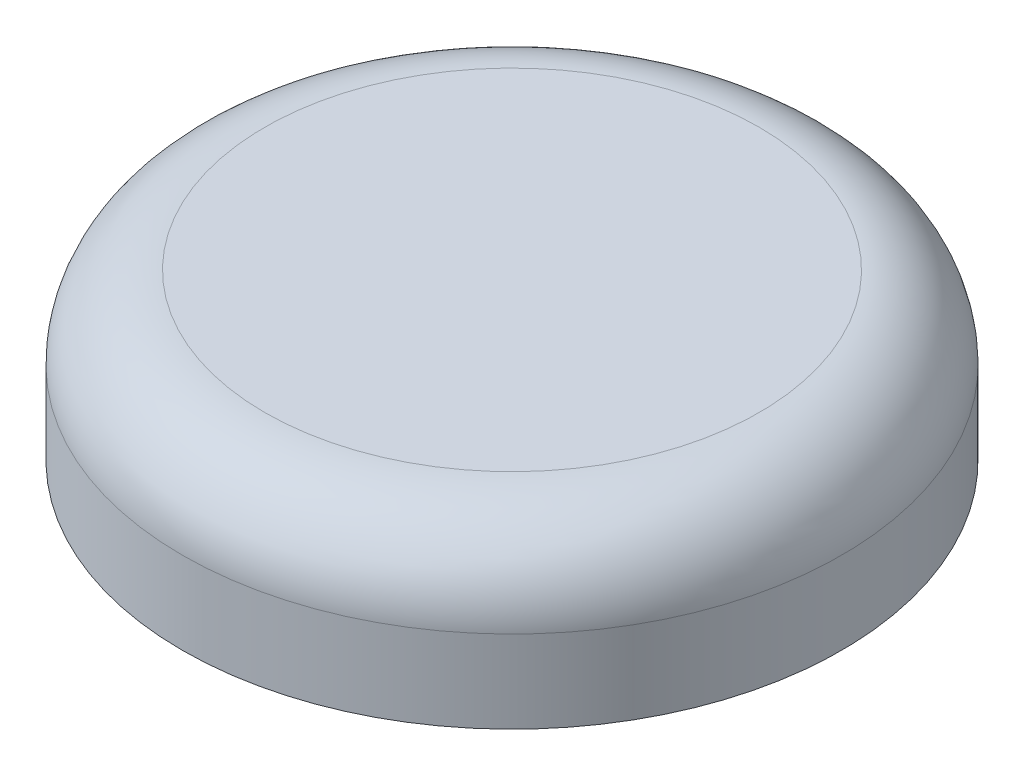
ISO-10303-21;
HEADER;
FILE_DESCRIPTION(('STEP AP214'),'2;1');
FILE_NAME('part.step','',(''),(''),'','','');
FILE_SCHEMA(('AUTOMOTIVE_DESIGN { 1 0 10303 214 1 1 1 1 }'));
ENDSEC;
DATA;
#1=APPLICATION_CONTEXT('core data for automotive mechanical design processes');
#2=APPLICATION_PROTOCOL_DEFINITION('international standard','automotive_design',2000,#1);
#3=PRODUCT_CONTEXT('',#1,'mechanical');
#4=PRODUCT('Part','Part','',(#3));
#5=PRODUCT_RELATED_PRODUCT_CATEGORY('part','',(#4));
#6=PRODUCT_DEFINITION_FORMATION('','',#4);
#7=PRODUCT_DEFINITION_CONTEXT('part definition',#1,'design');
#8=PRODUCT_DEFINITION('design','',#6,#7);
#9=PRODUCT_DEFINITION_SHAPE('','',#8);
#10=(LENGTH_UNIT() NAMED_UNIT(*) SI_UNIT(.MILLI.,.METRE.));
#11=(NAMED_UNIT(*) PLANE_ANGLE_UNIT() SI_UNIT($,.RADIAN.));
#12=(NAMED_UNIT(*) SI_UNIT($,.STERADIAN.) SOLID_ANGLE_UNIT());
#13=UNCERTAINTY_MEASURE_WITH_UNIT(LENGTH_MEASURE(1.E-05),#10,'distance_accuracy_value','');
#14=(GEOMETRIC_REPRESENTATION_CONTEXT(3) GLOBAL_UNCERTAINTY_ASSIGNED_CONTEXT((#13)) GLOBAL_UNIT_ASSIGNED_CONTEXT((#10,
#11,#12)) REPRESENTATION_CONTEXT('',''));
#15=CARTESIAN_POINT('',(0.,0.,0.));
#16=DIRECTION('',(0.,0.,1.));
#17=DIRECTION('',(1.,0.,0.));
#18=AXIS2_PLACEMENT_3D('',#15,#16,#17);
#19=CARTESIAN_POINT('',(0.,10.,0.));
#20=DIRECTION('',(0.,-1.,0.));
#21=DIRECTION('',(0.,0.,-1.));
#22=AXIS2_PLACEMENT_3D('',#19,#20,#21);
#23=CYLINDRICAL_SURFACE('',#22,20.);
#24=CARTESIAN_POINT('',(0.,5.,0.));
#25=DIRECTION('',(0.,1.,0.));
#26=DIRECTION('',(0.,0.,1.));
#27=AXIS2_PLACEMENT_3D('',#24,#25,#26);
#28=CIRCLE('',#27,20.);
#29=CARTESIAN_POINT('',(0.,5.,20.));
#30=VERTEX_POINT('',#29);
#31=EDGE_CURVE('E10',#30,#30,#28,.F.);
#32=ORIENTED_EDGE('',*,*,#31,.T.);
#33=EDGE_LOOP('',(#32));
#34=FACE_BOUND('',#33,.T.);
#35=CARTESIAN_POINT('',(0.,0.,0.));
#36=DIRECTION('',(0.,1.,0.));
#37=DIRECTION('',(0.,0.,1.));
#38=AXIS2_PLACEMENT_3D('',#35,#36,#37);
#39=CIRCLE('',#38,20.);
#40=CARTESIAN_POINT('',(0.,0.,20.));
#41=VERTEX_POINT('',#40);
#42=EDGE_CURVE('E49',#41,#41,#39,.T.);
#43=ORIENTED_EDGE('',*,*,#42,.T.);
#44=EDGE_LOOP('',(#43));
#45=FACE_BOUND('',#44,.T.);
#46=ADVANCED_FACE('F39',(#34,#45),#23,.T.);
#47=CARTESIAN_POINT('',(0.,10.,0.));
#48=DIRECTION('',(0.,1.,0.));
#49=DIRECTION('',(0.,0.,1.));
#50=AXIS2_PLACEMENT_3D('',#47,#48,#49);
#51=PLANE('',#50);
#52=CARTESIAN_POINT('',(0.,10.,0.));
#53=DIRECTION('',(0.,1.,0.));
#54=DIRECTION('',(0.,0.,1.));
#55=AXIS2_PLACEMENT_3D('',#52,#53,#54);
#56=CIRCLE('',#55,15.);
#57=CARTESIAN_POINT('',(0.,10.,15.));
#58=VERTEX_POINT('',#57);
#59=EDGE_CURVE('E46',#58,#58,#56,.T.);
#60=ORIENTED_EDGE('',*,*,#59,.T.);
#61=EDGE_LOOP('',(#60));
#62=FACE_BOUND('',#61,.T.);
#63=ADVANCED_FACE('F74',(#62),#51,.T.);
#64=CARTESIAN_POINT('',(0.,0.,0.));
#65=DIRECTION('',(0.,1.,0.));
#66=DIRECTION('',(0.,0.,1.));
#67=AXIS2_PLACEMENT_3D('',#64,#65,#66);
#68=PLANE('',#67);
#69=CARTESIAN_POINT('',(0.,0.,0.));
#70=DIRECTION('',(0.,-1.,0.));
#71=DIRECTION('',(0.,0.,-1.));
#72=AXIS2_PLACEMENT_3D('',#69,#70,#71);
#73=CIRCLE('',#72,10.);
#74=CARTESIAN_POINT('',(0.,0.,-10.));
#75=VERTEX_POINT('',#74);
#76=EDGE_CURVE('E60',#75,#75,#73,.T.);
#77=ORIENTED_EDGE('',*,*,#76,.F.);
#78=EDGE_LOOP('',(#77));
#79=FACE_BOUND('',#78,.T.);
#80=ORIENTED_EDGE('',*,*,#42,.F.);
#81=EDGE_LOOP('',(#80));
#82=FACE_BOUND('',#81,.T.);
#83=ADVANCED_FACE('F72',(#79,#82),#68,.F.);
#84=CARTESIAN_POINT('',(0.,5.,0.));
#85=DIRECTION('',(0.,1.,0.));
#86=DIRECTION('',(0.,0.,1.));
#87=AXIS2_PLACEMENT_3D('',#84,#85,#86);
#88=TOROIDAL_SURFACE('',#87,15.,5.);
#89=ORIENTED_EDGE('',*,*,#31,.F.);
#90=EDGE_LOOP('',(#89));
#91=FACE_BOUND('',#90,.T.);
#92=ORIENTED_EDGE('',*,*,#59,.F.);
#93=EDGE_LOOP('',(#92));
#94=FACE_BOUND('',#93,.T.);
#95=ADVANCED_FACE('F41',(#91,#94),#88,.T.);
#96=CARTESIAN_POINT('',(0.,5.,0.));
#97=DIRECTION('',(0.,-1.,0.));
#98=DIRECTION('',(0.,0.,-1.));
#99=AXIS2_PLACEMENT_3D('',#96,#97,#98);
#100=CYLINDRICAL_SURFACE('',#99,10.);
#101=CARTESIAN_POINT('',(0.,5.,0.));
#102=DIRECTION('',(0.,-1.,0.));
#103=DIRECTION('',(0.,0.,-1.));
#104=AXIS2_PLACEMENT_3D('',#101,#102,#103);
#105=CIRCLE('',#104,10.);
#106=CARTESIAN_POINT('',(0.,5.,-10.));
#107=VERTEX_POINT('',#106);
#108=EDGE_CURVE('E53',#107,#107,#105,.T.);
#109=ORIENTED_EDGE('',*,*,#108,.F.);
#110=EDGE_LOOP('',(#109));
#111=FACE_BOUND('',#110,.T.);
#112=ORIENTED_EDGE('',*,*,#76,.T.);
#113=EDGE_LOOP('',(#112));
#114=FACE_BOUND('',#113,.T.);
#115=ADVANCED_FACE('F63',(#111,#114),#100,.F.);
#116=CARTESIAN_POINT('',(0.,5.,0.));
#117=DIRECTION('',(0.,-1.,0.));
#118=DIRECTION('',(0.,0.,-1.));
#119=AXIS2_PLACEMENT_3D('',#116,#117,#118);
#120=PLANE('',#119);
#121=ORIENTED_EDGE('',*,*,#108,.T.);
#122=EDGE_LOOP('',(#121));
#123=FACE_BOUND('',#122,.T.);
#124=ADVANCED_FACE('F64',(#123),#120,.T.);
#125=CLOSED_SHELL('',(#46,#63,#83,#95,#115,#124));
#126=MANIFOLD_SOLID_BREP('B2',#125);
#127=ADVANCED_BREP_SHAPE_REPRESENTATION('',(#18,#126),#14);
#128=SHAPE_DEFINITION_REPRESENTATION(#9,#127);
ENDSEC;
END-ISO-10303-21;
